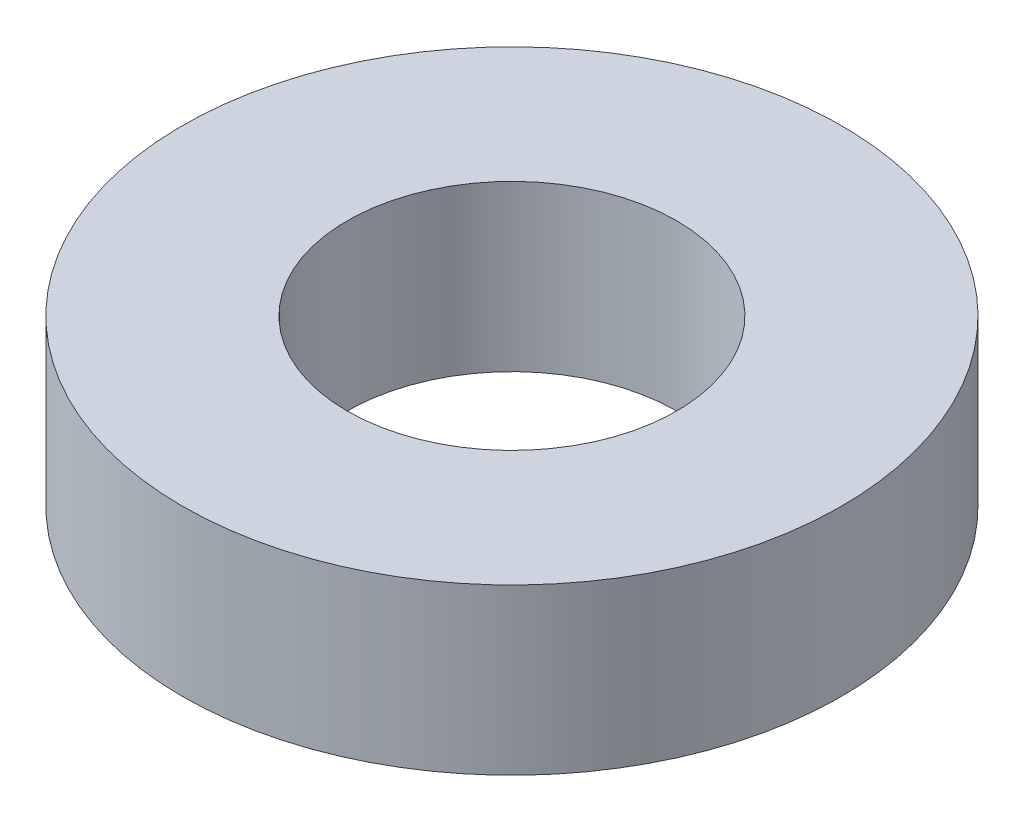
ISO-10303-21;
HEADER;
FILE_DESCRIPTION(('STEP AP214'),'2;1');
FILE_NAME('part.step','',(''),(''),'','','');
FILE_SCHEMA(('AUTOMOTIVE_DESIGN { 1 0 10303 214 1 1 1 1 }'));
ENDSEC;
DATA;
#1=APPLICATION_CONTEXT('core data for automotive mechanical design processes');
#2=APPLICATION_PROTOCOL_DEFINITION('international standard','automotive_design',2000,#1);
#3=PRODUCT_CONTEXT('',#1,'mechanical');
#4=PRODUCT('Part','Part','',(#3));
#5=PRODUCT_RELATED_PRODUCT_CATEGORY('part','',(#4));
#6=PRODUCT_DEFINITION_FORMATION('','',#4);
#7=PRODUCT_DEFINITION_CONTEXT('part definition',#1,'design');
#8=PRODUCT_DEFINITION('design','',#6,#7);
#9=PRODUCT_DEFINITION_SHAPE('','',#8);
#10=(LENGTH_UNIT() NAMED_UNIT(*) SI_UNIT(.MILLI.,.METRE.));
#11=(NAMED_UNIT(*) PLANE_ANGLE_UNIT() SI_UNIT($,.RADIAN.));
#12=(NAMED_UNIT(*) SI_UNIT($,.STERADIAN.) SOLID_ANGLE_UNIT());
#13=UNCERTAINTY_MEASURE_WITH_UNIT(LENGTH_MEASURE(1.E-05),#10,'distance_accuracy_value','');
#14=(GEOMETRIC_REPRESENTATION_CONTEXT(3) GLOBAL_UNCERTAINTY_ASSIGNED_CONTEXT((#13)) GLOBAL_UNIT_ASSIGNED_CONTEXT((#10,
#11,#12)) REPRESENTATION_CONTEXT('',''));
#15=CARTESIAN_POINT('',(0.,0.,0.));
#16=DIRECTION('',(0.,0.,1.));
#17=DIRECTION('',(1.,0.,0.));
#18=AXIS2_PLACEMENT_3D('',#15,#16,#17);
#19=CARTESIAN_POINT('',(0.,12.7,0.));
#20=DIRECTION('',(0.,1.,0.));
#21=DIRECTION('',(0.,0.,1.));
#22=AXIS2_PLACEMENT_3D('',#19,#20,#21);
#23=PLANE('',#22);
#24=CARTESIAN_POINT('',(0.,12.7,0.));
#25=DIRECTION('',(0.,1.,0.));
#26=DIRECTION('',(0.,0.,1.));
#27=AXIS2_PLACEMENT_3D('',#24,#25,#26);
#28=CIRCLE('',#27,25.4);
#29=CARTESIAN_POINT('',(0.,12.7,25.4));
#30=VERTEX_POINT('',#29);
#31=EDGE_CURVE('E10',#30,#30,#28,.T.);
#32=ORIENTED_EDGE('',*,*,#31,.T.);
#33=EDGE_LOOP('',(#32));
#34=FACE_BOUND('',#33,.T.);
#35=CARTESIAN_POINT('',(0.,12.7,0.));
#36=DIRECTION('',(0.,1.,0.));
#37=DIRECTION('',(0.,0.,1.));
#38=AXIS2_PLACEMENT_3D('',#35,#36,#37);
#39=CIRCLE('',#38,12.7);
#40=CARTESIAN_POINT('',(0.,12.7,12.7));
#41=VERTEX_POINT('',#40);
#42=EDGE_CURVE('E59',#41,#41,#39,.T.);
#43=ORIENTED_EDGE('',*,*,#42,.F.);
#44=EDGE_LOOP('',(#43));
#45=FACE_BOUND('',#44,.T.);
#46=ADVANCED_FACE('F44',(#34,#45),#23,.T.);
#47=CARTESIAN_POINT('',(0.,0.,0.));
#48=DIRECTION('',(0.,1.,0.));
#49=DIRECTION('',(0.,0.,1.));
#50=AXIS2_PLACEMENT_3D('',#47,#48,#49);
#51=PLANE('',#50);
#52=CARTESIAN_POINT('',(0.,0.,0.));
#53=DIRECTION('',(0.,1.,0.));
#54=DIRECTION('',(0.,0.,1.));
#55=AXIS2_PLACEMENT_3D('',#52,#53,#54);
#56=CIRCLE('',#55,25.4);
#57=CARTESIAN_POINT('',(0.,0.,25.4));
#58=VERTEX_POINT('',#57);
#59=EDGE_CURVE('E47',#58,#58,#56,.T.);
#60=ORIENTED_EDGE('',*,*,#59,.F.);
#61=EDGE_LOOP('',(#60));
#62=FACE_BOUND('',#61,.T.);
#63=CARTESIAN_POINT('',(0.,0.,0.));
#64=DIRECTION('',(0.,1.,0.));
#65=DIRECTION('',(0.,0.,1.));
#66=AXIS2_PLACEMENT_3D('',#63,#64,#65);
#67=CIRCLE('',#66,12.7);
#68=CARTESIAN_POINT('',(0.,0.,12.7));
#69=VERTEX_POINT('',#68);
#70=EDGE_CURVE('E58',#69,#69,#67,.T.);
#71=ORIENTED_EDGE('',*,*,#70,.T.);
#72=EDGE_LOOP('',(#71));
#73=FACE_BOUND('',#72,.T.);
#74=ADVANCED_FACE('F72',(#62,#73),#51,.F.);
#75=CARTESIAN_POINT('',(0.,12.7,0.));
#76=DIRECTION('',(0.,-1.,0.));
#77=DIRECTION('',(0.,0.,-1.));
#78=AXIS2_PLACEMENT_3D('',#75,#76,#77);
#79=CYLINDRICAL_SURFACE('',#78,25.4);
#80=ORIENTED_EDGE('',*,*,#31,.F.);
#81=EDGE_LOOP('',(#80));
#82=FACE_BOUND('',#81,.T.);
#83=ORIENTED_EDGE('',*,*,#59,.T.);
#84=EDGE_LOOP('',(#83));
#85=FACE_BOUND('',#84,.T.);
#86=ADVANCED_FACE('F50',(#82,#85),#79,.T.);
#87=CARTESIAN_POINT('',(0.,12.7,0.));
#88=DIRECTION('',(0.,-1.,0.));
#89=DIRECTION('',(0.,0.,-1.));
#90=AXIS2_PLACEMENT_3D('',#87,#88,#89);
#91=CYLINDRICAL_SURFACE('',#90,12.7);
#92=ORIENTED_EDGE('',*,*,#42,.T.);
#93=EDGE_LOOP('',(#92));
#94=FACE_BOUND('',#93,.T.);
#95=ORIENTED_EDGE('',*,*,#70,.F.);
#96=EDGE_LOOP('',(#95));
#97=FACE_BOUND('',#96,.T.);
#98=ADVANCED_FACE('F66',(#94,#97),#91,.F.);
#99=CLOSED_SHELL('',(#46,#74,#86,#98));
#100=MANIFOLD_SOLID_BREP('B2',#99);
#101=ADVANCED_BREP_SHAPE_REPRESENTATION('',(#18,#100),#14);
#102=SHAPE_DEFINITION_REPRESENTATION(#9,#101);
ENDSEC;
END-ISO-10303-21;
